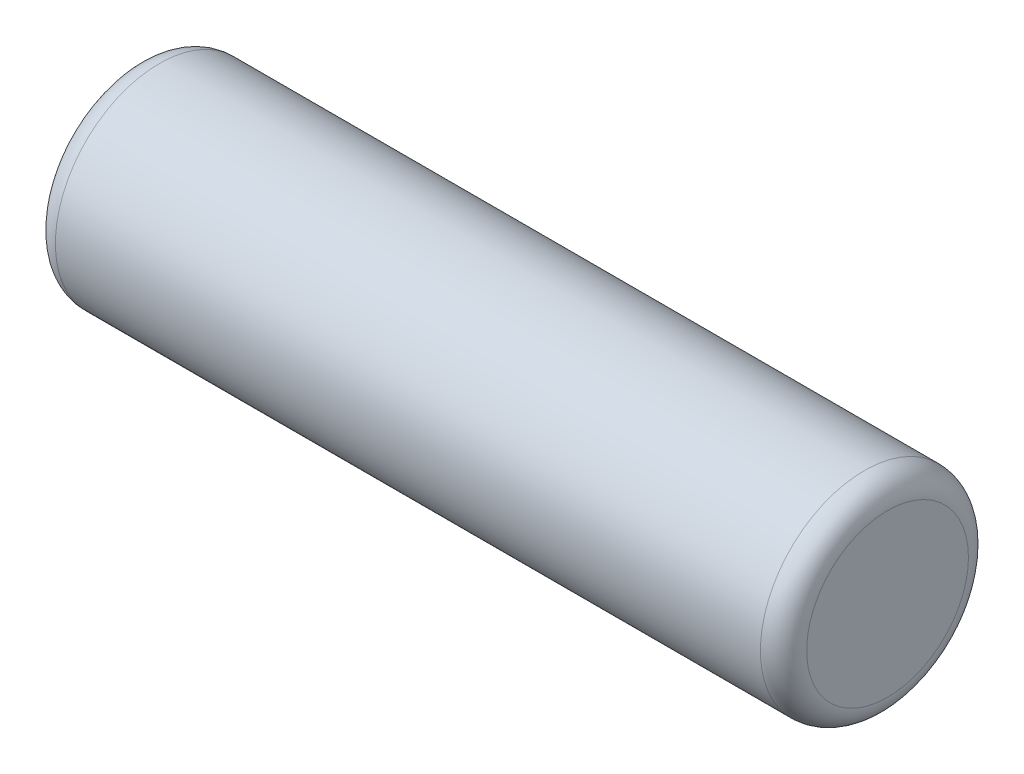
ISO-10303-21;
HEADER;
FILE_DESCRIPTION(('STEP AP214'),'2;1');
FILE_NAME('part.step','',(''),(''),'','','');
FILE_SCHEMA(('AUTOMOTIVE_DESIGN { 1 0 10303 214 1 1 1 1 }'));
ENDSEC;
DATA;
#1=APPLICATION_CONTEXT('core data for automotive mechanical design processes');
#2=APPLICATION_PROTOCOL_DEFINITION('international standard','automotive_design',2000,#1);
#3=PRODUCT_CONTEXT('',#1,'mechanical');
#4=PRODUCT('Part','Part','',(#3));
#5=PRODUCT_RELATED_PRODUCT_CATEGORY('part','',(#4));
#6=PRODUCT_DEFINITION_FORMATION('','',#4);
#7=PRODUCT_DEFINITION_CONTEXT('part definition',#1,'design');
#8=PRODUCT_DEFINITION('design','',#6,#7);
#9=PRODUCT_DEFINITION_SHAPE('','',#8);
#10=(LENGTH_UNIT() NAMED_UNIT(*) SI_UNIT(.MILLI.,.METRE.));
#11=(NAMED_UNIT(*) PLANE_ANGLE_UNIT() SI_UNIT($,.RADIAN.));
#12=(NAMED_UNIT(*) SI_UNIT($,.STERADIAN.) SOLID_ANGLE_UNIT());
#13=UNCERTAINTY_MEASURE_WITH_UNIT(LENGTH_MEASURE(1.E-05),#10,'distance_accuracy_value','');
#14=(GEOMETRIC_REPRESENTATION_CONTEXT(3) GLOBAL_UNCERTAINTY_ASSIGNED_CONTEXT((#13)) GLOBAL_UNIT_ASSIGNED_CONTEXT((#10,
#11,#12)) REPRESENTATION_CONTEXT('',''));
#15=CARTESIAN_POINT('',(0.,0.,0.));
#16=DIRECTION('',(0.,0.,1.));
#17=DIRECTION('',(1.,0.,0.));
#18=AXIS2_PLACEMENT_3D('',#15,#16,#17);
#19=CARTESIAN_POINT('',(65.,0.,0.));
#20=DIRECTION('',(-1.,0.,0.));
#21=DIRECTION('',(0.,0.,1.));
#22=AXIS2_PLACEMENT_3D('',#19,#20,#21);
#23=CYLINDRICAL_SURFACE('',#22,9.);
#24=CARTESIAN_POINT('',(63.,0.,0.));
#25=DIRECTION('',(1.,0.,0.));
#26=DIRECTION('',(0.,0.,-1.));
#27=AXIS2_PLACEMENT_3D('',#24,#25,#26);
#28=CIRCLE('',#27,9.);
#29=CARTESIAN_POINT('',(63.,0.,-9.));
#30=VERTEX_POINT('',#29);
#31=EDGE_CURVE('E39',#30,#30,#28,.F.);
#32=ORIENTED_EDGE('',*,*,#31,.T.);
#33=EDGE_LOOP('',(#32));
#34=FACE_BOUND('',#33,.T.);
#35=CARTESIAN_POINT('',(2.,0.,0.));
#36=DIRECTION('',(1.,0.,0.));
#37=DIRECTION('',(0.,0.,-1.));
#38=AXIS2_PLACEMENT_3D('',#35,#36,#37);
#39=CIRCLE('',#38,9.);
#40=CARTESIAN_POINT('',(2.,0.,-9.));
#41=VERTEX_POINT('',#40);
#42=EDGE_CURVE('E43',#41,#41,#39,.T.);
#43=ORIENTED_EDGE('',*,*,#42,.T.);
#44=EDGE_LOOP('',(#43));
#45=FACE_BOUND('',#44,.T.);
#46=ADVANCED_FACE('F32',(#34,#45),#23,.T.);
#47=CARTESIAN_POINT('',(65.,0.,0.));
#48=DIRECTION('',(1.,0.,0.));
#49=DIRECTION('',(0.,0.,-1.));
#50=AXIS2_PLACEMENT_3D('',#47,#48,#49);
#51=PLANE('',#50);
#52=CARTESIAN_POINT('',(65.,0.,0.));
#53=DIRECTION('',(1.,0.,0.));
#54=DIRECTION('',(0.,0.,-1.));
#55=AXIS2_PLACEMENT_3D('',#52,#53,#54);
#56=CIRCLE('',#55,7.);
#57=CARTESIAN_POINT('',(65.,0.,-7.));
#58=VERTEX_POINT('',#57);
#59=EDGE_CURVE('E47',#58,#58,#56,.T.);
#60=ORIENTED_EDGE('',*,*,#59,.T.);
#61=EDGE_LOOP('',(#60));
#62=FACE_BOUND('',#61,.T.);
#63=ADVANCED_FACE('F53',(#62),#51,.T.);
#64=CARTESIAN_POINT('',(0.,0.,0.));
#65=DIRECTION('',(1.,0.,0.));
#66=DIRECTION('',(0.,0.,-1.));
#67=AXIS2_PLACEMENT_3D('',#64,#65,#66);
#68=PLANE('',#67);
#69=CARTESIAN_POINT('',(0.,0.,0.));
#70=DIRECTION('',(1.,0.,0.));
#71=DIRECTION('',(0.,0.,-1.));
#72=AXIS2_PLACEMENT_3D('',#69,#70,#71);
#73=CIRCLE('',#72,7.);
#74=CARTESIAN_POINT('',(0.,0.,-7.));
#75=VERTEX_POINT('',#74);
#76=EDGE_CURVE('E10',#75,#75,#73,.F.);
#77=ORIENTED_EDGE('',*,*,#76,.T.);
#78=EDGE_LOOP('',(#77));
#79=FACE_BOUND('',#78,.T.);
#80=ADVANCED_FACE('F57',(#79),#68,.F.);
#81=CARTESIAN_POINT('',(63.,0.,0.));
#82=DIRECTION('',(1.,0.,0.));
#83=DIRECTION('',(0.,0.,-1.));
#84=AXIS2_PLACEMENT_3D('',#81,#82,#83);
#85=TOROIDAL_SURFACE('',#84,7.,2.);
#86=ORIENTED_EDGE('',*,*,#31,.F.);
#87=EDGE_LOOP('',(#86));
#88=FACE_BOUND('',#87,.T.);
#89=ORIENTED_EDGE('',*,*,#59,.F.);
#90=EDGE_LOOP('',(#89));
#91=FACE_BOUND('',#90,.T.);
#92=ADVANCED_FACE('F55',(#88,#91),#85,.T.);
#93=CARTESIAN_POINT('',(2.,0.,0.));
#94=DIRECTION('',(1.,0.,0.));
#95=DIRECTION('',(0.,0.,-1.));
#96=AXIS2_PLACEMENT_3D('',#93,#94,#95);
#97=TOROIDAL_SURFACE('',#96,7.,2.);
#98=ORIENTED_EDGE('',*,*,#76,.F.);
#99=EDGE_LOOP('',(#98));
#100=FACE_BOUND('',#99,.T.);
#101=ORIENTED_EDGE('',*,*,#42,.F.);
#102=EDGE_LOOP('',(#101));
#103=FACE_BOUND('',#102,.T.);
#104=ADVANCED_FACE('F34',(#100,#103),#97,.T.);
#105=CLOSED_SHELL('',(#46,#63,#80,#92,#104));
#106=MANIFOLD_SOLID_BREP('B2',#105);
#107=ADVANCED_BREP_SHAPE_REPRESENTATION('',(#18,#106),#14);
#108=SHAPE_DEFINITION_REPRESENTATION(#9,#107);
ENDSEC;
END-ISO-10303-21;
